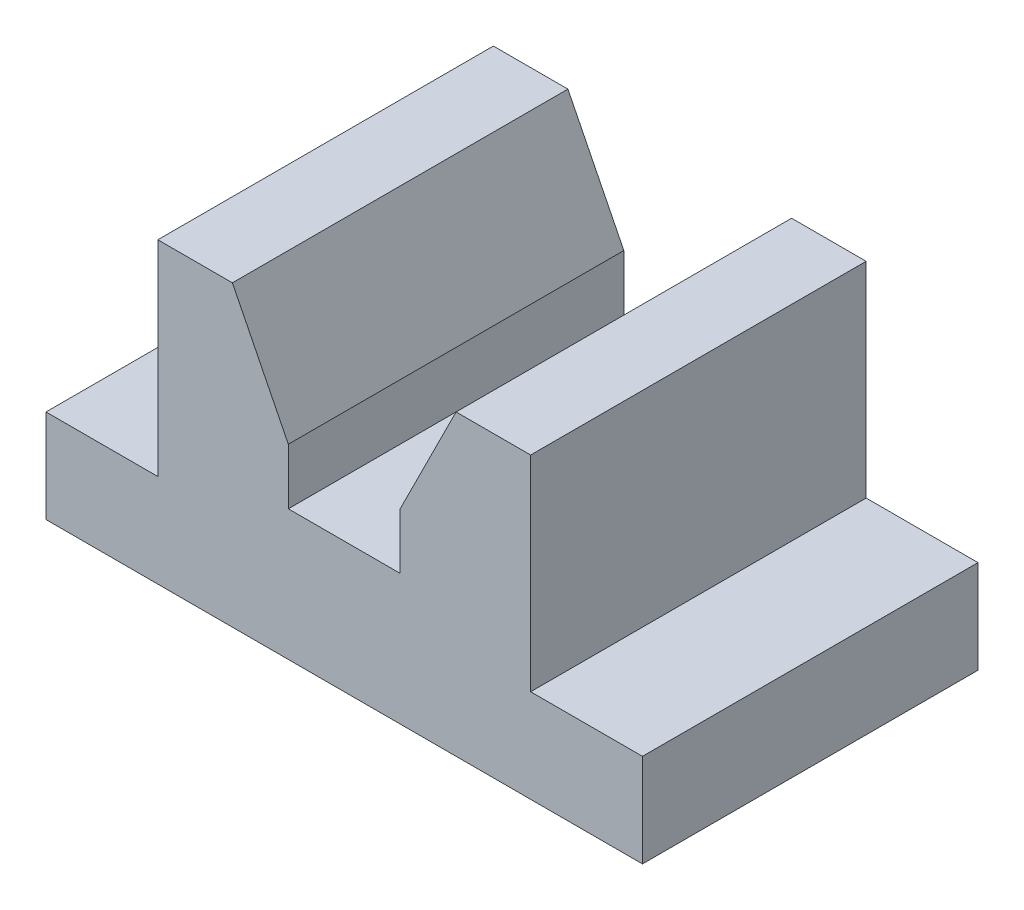
ISO-10303-21;
HEADER;
FILE_DESCRIPTION(('STEP AP214'),'2;1');
FILE_NAME('part.step','',(''),(''),'','','');
FILE_SCHEMA(('AUTOMOTIVE_DESIGN { 1 0 10303 214 1 1 1 1 }'));
ENDSEC;
DATA;
#1=APPLICATION_CONTEXT('core data for automotive mechanical design processes');
#2=APPLICATION_PROTOCOL_DEFINITION('international standard','automotive_design',2000,#1);
#3=PRODUCT_CONTEXT('',#1,'mechanical');
#4=PRODUCT('Part','Part','',(#3));
#5=PRODUCT_RELATED_PRODUCT_CATEGORY('part','',(#4));
#6=PRODUCT_DEFINITION_FORMATION('','',#4);
#7=PRODUCT_DEFINITION_CONTEXT('part definition',#1,'design');
#8=PRODUCT_DEFINITION('design','',#6,#7);
#9=PRODUCT_DEFINITION_SHAPE('','',#8);
#10=(LENGTH_UNIT() NAMED_UNIT(*) SI_UNIT(.MILLI.,.METRE.));
#11=(NAMED_UNIT(*) PLANE_ANGLE_UNIT() SI_UNIT($,.RADIAN.));
#12=(NAMED_UNIT(*) SI_UNIT($,.STERADIAN.) SOLID_ANGLE_UNIT());
#13=UNCERTAINTY_MEASURE_WITH_UNIT(LENGTH_MEASURE(1.E-05),#10,'distance_accuracy_value','');
#14=(GEOMETRIC_REPRESENTATION_CONTEXT(3) GLOBAL_UNCERTAINTY_ASSIGNED_CONTEXT((#13)) GLOBAL_UNIT_ASSIGNED_CONTEXT((#10,
#11,#12)) REPRESENTATION_CONTEXT('',''));
#15=CARTESIAN_POINT('',(0.,0.,0.));
#16=DIRECTION('',(0.,0.,1.));
#17=DIRECTION('',(1.,0.,0.));
#18=AXIS2_PLACEMENT_3D('',#15,#16,#17);
#19=CARTESIAN_POINT('',(-16.,0.,18.));
#20=DIRECTION('',(1.,0.,0.));
#21=DIRECTION('',(0.,0.,-1.));
#22=AXIS2_PLACEMENT_3D('',#19,#20,#21);
#23=PLANE('',#22);
#24=DIRECTION('',(0.,-1.,0.));
#25=VECTOR('',#24,1.);
#26=CARTESIAN_POINT('',(-16.,0.,0.));
#27=LINE('',#26,#25);
#28=CARTESIAN_POINT('',(-16.,5.,0.));
#29=VERTEX_POINT('',#28);
#30=CARTESIAN_POINT('',(-16.,0.,0.));
#31=VERTEX_POINT('',#30);
#32=EDGE_CURVE('E182',#29,#31,#27,.T.);
#33=ORIENTED_EDGE('',*,*,#32,.T.);
#34=DIRECTION('',(0.,0.,-1.));
#35=VECTOR('',#34,1.);
#36=CARTESIAN_POINT('',(-16.,0.,18.));
#37=LINE('',#36,#35);
#38=CARTESIAN_POINT('',(-16.,0.,18.));
#39=VERTEX_POINT('',#38);
#40=EDGE_CURVE('E11',#39,#31,#37,.T.);
#41=ORIENTED_EDGE('',*,*,#40,.F.);
#42=DIRECTION('',(0.,-1.,0.));
#43=VECTOR('',#42,1.);
#44=CARTESIAN_POINT('',(-16.,0.,18.));
#45=LINE('',#44,#43);
#46=CARTESIAN_POINT('',(-16.,5.,18.));
#47=VERTEX_POINT('',#46);
#48=EDGE_CURVE('E222',#47,#39,#45,.T.);
#49=ORIENTED_EDGE('',*,*,#48,.F.);
#50=DIRECTION('',(0.,0.,-1.));
#51=VECTOR('',#50,1.);
#52=CARTESIAN_POINT('',(-16.,5.,18.));
#53=LINE('',#52,#51);
#54=EDGE_CURVE('E178',#47,#29,#53,.T.);
#55=ORIENTED_EDGE('',*,*,#54,.T.);
#56=EDGE_LOOP('',(#33,#41,#49,#55));
#57=FACE_BOUND('',#56,.T.);
#58=ADVANCED_FACE('F45',(#57),#23,.F.);
#59=CARTESIAN_POINT('',(16.,0.,18.));
#60=DIRECTION('',(0.,1.,0.));
#61=DIRECTION('',(0.,0.,1.));
#62=AXIS2_PLACEMENT_3D('',#59,#60,#61);
#63=PLANE('',#62);
#64=DIRECTION('',(1.,0.,0.));
#65=VECTOR('',#64,1.);
#66=CARTESIAN_POINT('',(16.,0.,0.));
#67=LINE('',#66,#65);
#68=CARTESIAN_POINT('',(16.,0.,0.));
#69=VERTEX_POINT('',#68);
#70=EDGE_CURVE('E186',#31,#69,#67,.T.);
#71=ORIENTED_EDGE('',*,*,#70,.T.);
#72=DIRECTION('',(0.,0.,-1.));
#73=VECTOR('',#72,1.);
#74=CARTESIAN_POINT('',(16.,0.,18.));
#75=LINE('',#74,#73);
#76=CARTESIAN_POINT('',(16.,0.,18.));
#77=VERTEX_POINT('',#76);
#78=EDGE_CURVE('E54',#77,#69,#75,.T.);
#79=ORIENTED_EDGE('',*,*,#78,.F.);
#80=DIRECTION('',(1.,0.,0.));
#81=VECTOR('',#80,1.);
#82=CARTESIAN_POINT('',(16.,0.,18.));
#83=LINE('',#82,#81);
#84=EDGE_CURVE('E123',#39,#77,#83,.T.);
#85=ORIENTED_EDGE('',*,*,#84,.F.);
#86=ORIENTED_EDGE('',*,*,#40,.T.);
#87=EDGE_LOOP('',(#71,#79,#85,#86));
#88=FACE_BOUND('',#87,.T.);
#89=ADVANCED_FACE('F330',(#88),#63,.F.);
#90=CARTESIAN_POINT('',(16.,0.,18.));
#91=DIRECTION('',(-1.,0.,0.));
#92=DIRECTION('',(0.,0.,1.));
#93=AXIS2_PLACEMENT_3D('',#90,#91,#92);
#94=PLANE('',#93);
#95=DIRECTION('',(0.,1.,0.));
#96=VECTOR('',#95,1.);
#97=CARTESIAN_POINT('',(16.,0.,0.));
#98=LINE('',#97,#96);
#99=CARTESIAN_POINT('',(16.,5.,0.));
#100=VERTEX_POINT('',#99);
#101=EDGE_CURVE('E189',#69,#100,#98,.T.);
#102=ORIENTED_EDGE('',*,*,#101,.T.);
#103=DIRECTION('',(0.,0.,-1.));
#104=VECTOR('',#103,1.);
#105=CARTESIAN_POINT('',(16.,5.,18.));
#106=LINE('',#105,#104);
#107=CARTESIAN_POINT('',(16.,5.,18.));
#108=VERTEX_POINT('',#107);
#109=EDGE_CURVE('E257',#108,#100,#106,.T.);
#110=ORIENTED_EDGE('',*,*,#109,.F.);
#111=DIRECTION('',(0.,1.,0.));
#112=VECTOR('',#111,1.);
#113=CARTESIAN_POINT('',(16.,0.,18.));
#114=LINE('',#113,#112);
#115=EDGE_CURVE('E267',#77,#108,#114,.T.);
#116=ORIENTED_EDGE('',*,*,#115,.F.);
#117=ORIENTED_EDGE('',*,*,#78,.T.);
#118=EDGE_LOOP('',(#102,#110,#116,#117));
#119=FACE_BOUND('',#118,.T.);
#120=ADVANCED_FACE('F265',(#119),#94,.F.);
#121=CARTESIAN_POINT('',(16.,5.,18.));
#122=DIRECTION('',(0.,-1.,0.));
#123=DIRECTION('',(1.,0.,0.));
#124=AXIS2_PLACEMENT_3D('',#121,#122,#123);
#125=PLANE('',#124);
#126=DIRECTION('',(-1.,0.,0.));
#127=VECTOR('',#126,1.);
#128=CARTESIAN_POINT('',(16.,5.,0.));
#129=LINE('',#128,#127);
#130=CARTESIAN_POINT('',(10.,4.99999999999999,0.));
#131=VERTEX_POINT('',#130);
#132=EDGE_CURVE('E192',#100,#131,#129,.T.);
#133=ORIENTED_EDGE('',*,*,#132,.T.);
#134=DIRECTION('',(0.,0.,-1.));
#135=VECTOR('',#134,1.);
#136=CARTESIAN_POINT('',(10.,4.99999999999999,18.));
#137=LINE('',#136,#135);
#138=CARTESIAN_POINT('',(10.,4.99999999999999,18.));
#139=VERTEX_POINT('',#138);
#140=EDGE_CURVE('E253',#139,#131,#137,.T.);
#141=ORIENTED_EDGE('',*,*,#140,.F.);
#142=DIRECTION('',(-1.,0.,0.));
#143=VECTOR('',#142,1.);
#144=CARTESIAN_POINT('',(16.,5.,18.));
#145=LINE('',#144,#143);
#146=EDGE_CURVE('E286',#108,#139,#145,.T.);
#147=ORIENTED_EDGE('',*,*,#146,.F.);
#148=ORIENTED_EDGE('',*,*,#109,.T.);
#149=EDGE_LOOP('',(#133,#141,#147,#148));
#150=FACE_BOUND('',#149,.T.);
#151=ADVANCED_FACE('F276',(#150),#125,.F.);
#152=CARTESIAN_POINT('',(10.,4.99999999999999,18.));
#153=DIRECTION('',(-1.,0.,0.));
#154=DIRECTION('',(0.,-1.,0.));
#155=AXIS2_PLACEMENT_3D('',#152,#153,#154);
#156=PLANE('',#155);
#157=DIRECTION('',(0.,1.,0.));
#158=VECTOR('',#157,1.);
#159=CARTESIAN_POINT('',(10.,4.99999999999999,0.));
#160=LINE('',#159,#158);
#161=CARTESIAN_POINT('',(10.,16.,0.));
#162=VERTEX_POINT('',#161);
#163=EDGE_CURVE('E195',#131,#162,#160,.T.);
#164=ORIENTED_EDGE('',*,*,#163,.T.);
#165=DIRECTION('',(0.,0.,-1.));
#166=VECTOR('',#165,1.);
#167=CARTESIAN_POINT('',(10.,16.,18.));
#168=LINE('',#167,#166);
#169=CARTESIAN_POINT('',(10.,16.,18.));
#170=VERTEX_POINT('',#169);
#171=EDGE_CURVE('E249',#170,#162,#168,.T.);
#172=ORIENTED_EDGE('',*,*,#171,.F.);
#173=DIRECTION('',(0.,1.,0.));
#174=VECTOR('',#173,1.);
#175=CARTESIAN_POINT('',(10.,4.99999999999999,18.));
#176=LINE('',#175,#174);
#177=EDGE_CURVE('E282',#139,#170,#176,.T.);
#178=ORIENTED_EDGE('',*,*,#177,.F.);
#179=ORIENTED_EDGE('',*,*,#140,.T.);
#180=EDGE_LOOP('',(#164,#172,#178,#179));
#181=FACE_BOUND('',#180,.T.);
#182=ADVANCED_FACE('F280',(#181),#156,.F.);
#183=CARTESIAN_POINT('',(10.,16.,18.));
#184=DIRECTION('',(0.,-1.,0.));
#185=DIRECTION('',(1.,0.,0.));
#186=AXIS2_PLACEMENT_3D('',#183,#184,#185);
#187=PLANE('',#186);
#188=DIRECTION('',(-1.,0.,0.));
#189=VECTOR('',#188,1.);
#190=CARTESIAN_POINT('',(10.,16.,0.));
#191=LINE('',#190,#189);
#192=CARTESIAN_POINT('',(6.,16.,0.));
#193=VERTEX_POINT('',#192);
#194=EDGE_CURVE('E198',#162,#193,#191,.T.);
#195=ORIENTED_EDGE('',*,*,#194,.T.);
#196=DIRECTION('',(0.,0.,-1.));
#197=VECTOR('',#196,1.);
#198=CARTESIAN_POINT('',(6.,16.,18.));
#199=LINE('',#198,#197);
#200=CARTESIAN_POINT('',(6.,16.,18.));
#201=VERTEX_POINT('',#200);
#202=EDGE_CURVE('E245',#201,#193,#199,.T.);
#203=ORIENTED_EDGE('',*,*,#202,.F.);
#204=DIRECTION('',(-1.,0.,0.));
#205=VECTOR('',#204,1.);
#206=CARTESIAN_POINT('',(10.,16.,18.));
#207=LINE('',#206,#205);
#208=EDGE_CURVE('E285',#170,#201,#207,.T.);
#209=ORIENTED_EDGE('',*,*,#208,.F.);
#210=ORIENTED_EDGE('',*,*,#171,.T.);
#211=EDGE_LOOP('',(#195,#203,#209,#210));
#212=FACE_BOUND('',#211,.T.);
#213=ADVANCED_FACE('F343',(#212),#187,.F.);
#214=CARTESIAN_POINT('',(6.,16.,18.));
#215=DIRECTION('',(0.894427190999916,-0.447213595499957,0.));
#216=DIRECTION('',(0.447213595499957,0.894427190999916,0.));
#217=AXIS2_PLACEMENT_3D('',#214,#215,#216);
#218=PLANE('',#217);
#219=DIRECTION('',(-0.447213595499957,-0.894427190999916,0.));
#220=VECTOR('',#219,1.);
#221=CARTESIAN_POINT('',(6.,16.,0.));
#222=LINE('',#221,#220);
#223=CARTESIAN_POINT('',(3.,10.,0.));
#224=VERTEX_POINT('',#223);
#225=EDGE_CURVE('E201',#193,#224,#222,.T.);
#226=ORIENTED_EDGE('',*,*,#225,.T.);
#227=DIRECTION('',(0.,0.,-1.));
#228=VECTOR('',#227,1.);
#229=CARTESIAN_POINT('',(3.,10.,18.));
#230=LINE('',#229,#228);
#231=CARTESIAN_POINT('',(3.,10.,18.));
#232=VERTEX_POINT('',#231);
#233=EDGE_CURVE('E241',#232,#224,#230,.T.);
#234=ORIENTED_EDGE('',*,*,#233,.F.);
#235=DIRECTION('',(-0.447213595499957,-0.894427190999916,0.));
#236=VECTOR('',#235,1.);
#237=CARTESIAN_POINT('',(6.,16.,18.));
#238=LINE('',#237,#236);
#239=EDGE_CURVE('E290',#201,#232,#238,.T.);
#240=ORIENTED_EDGE('',*,*,#239,.F.);
#241=ORIENTED_EDGE('',*,*,#202,.T.);
#242=EDGE_LOOP('',(#226,#234,#240,#241));
#243=FACE_BOUND('',#242,.T.);
#244=ADVANCED_FACE('F346',(#243),#218,.F.);
#245=CARTESIAN_POINT('',(3.,10.,18.));
#246=DIRECTION('',(1.,0.,0.));
#247=DIRECTION('',(0.,1.,0.));
#248=AXIS2_PLACEMENT_3D('',#245,#246,#247);
#249=PLANE('',#248);
#250=DIRECTION('',(0.,-1.,0.));
#251=VECTOR('',#250,1.);
#252=CARTESIAN_POINT('',(3.,10.,0.));
#253=LINE('',#252,#251);
#254=CARTESIAN_POINT('',(3.,7.,0.));
#255=VERTEX_POINT('',#254);
#256=EDGE_CURVE('E204',#224,#255,#253,.T.);
#257=ORIENTED_EDGE('',*,*,#256,.T.);
#258=DIRECTION('',(0.,0.,-1.));
#259=VECTOR('',#258,1.);
#260=CARTESIAN_POINT('',(3.,7.,18.));
#261=LINE('',#260,#259);
#262=CARTESIAN_POINT('',(3.,7.,18.));
#263=VERTEX_POINT('',#262);
#264=EDGE_CURVE('E237',#263,#255,#261,.T.);
#265=ORIENTED_EDGE('',*,*,#264,.F.);
#266=DIRECTION('',(0.,-1.,0.));
#267=VECTOR('',#266,1.);
#268=CARTESIAN_POINT('',(3.,10.,18.));
#269=LINE('',#268,#267);
#270=EDGE_CURVE('E297',#232,#263,#269,.T.);
#271=ORIENTED_EDGE('',*,*,#270,.F.);
#272=ORIENTED_EDGE('',*,*,#233,.T.);
#273=EDGE_LOOP('',(#257,#265,#271,#272));
#274=FACE_BOUND('',#273,.T.);
#275=ADVANCED_FACE('F350',(#274),#249,.F.);
#276=CARTESIAN_POINT('',(-3.,7.,18.));
#277=DIRECTION('',(0.,-1.,0.));
#278=DIRECTION('',(0.,0.,-1.));
#279=AXIS2_PLACEMENT_3D('',#276,#277,#278);
#280=PLANE('',#279);
#281=DIRECTION('',(-1.,0.,0.));
#282=VECTOR('',#281,1.);
#283=CARTESIAN_POINT('',(-3.,7.,0.));
#284=LINE('',#283,#282);
#285=CARTESIAN_POINT('',(-3.,7.,0.));
#286=VERTEX_POINT('',#285);
#287=EDGE_CURVE('E207',#255,#286,#284,.T.);
#288=ORIENTED_EDGE('',*,*,#287,.T.);
#289=DIRECTION('',(0.,0.,-1.));
#290=VECTOR('',#289,1.);
#291=CARTESIAN_POINT('',(-3.,7.,18.));
#292=LINE('',#291,#290);
#293=CARTESIAN_POINT('',(-3.,7.,18.));
#294=VERTEX_POINT('',#293);
#295=EDGE_CURVE('E233',#294,#286,#292,.T.);
#296=ORIENTED_EDGE('',*,*,#295,.F.);
#297=DIRECTION('',(-1.,0.,0.));
#298=VECTOR('',#297,1.);
#299=CARTESIAN_POINT('',(-3.,7.,18.));
#300=LINE('',#299,#298);
#301=EDGE_CURVE('E300',#263,#294,#300,.T.);
#302=ORIENTED_EDGE('',*,*,#301,.F.);
#303=ORIENTED_EDGE('',*,*,#264,.T.);
#304=EDGE_LOOP('',(#288,#296,#302,#303));
#305=FACE_BOUND('',#304,.T.);
#306=ADVANCED_FACE('F354',(#305),#280,.F.);
#307=CARTESIAN_POINT('',(-3.,10.,18.));
#308=DIRECTION('',(-1.,0.,0.));
#309=DIRECTION('',(0.,-1.,0.));
#310=AXIS2_PLACEMENT_3D('',#307,#308,#309);
#311=PLANE('',#310);
#312=DIRECTION('',(0.,1.,0.));
#313=VECTOR('',#312,1.);
#314=CARTESIAN_POINT('',(-3.,10.,0.));
#315=LINE('',#314,#313);
#316=CARTESIAN_POINT('',(-3.,10.,0.));
#317=VERTEX_POINT('',#316);
#318=EDGE_CURVE('E210',#286,#317,#315,.T.);
#319=ORIENTED_EDGE('',*,*,#318,.T.);
#320=DIRECTION('',(0.,0.,-1.));
#321=VECTOR('',#320,1.);
#322=CARTESIAN_POINT('',(-3.,10.,18.));
#323=LINE('',#322,#321);
#324=CARTESIAN_POINT('',(-3.,10.,18.));
#325=VERTEX_POINT('',#324);
#326=EDGE_CURVE('E229',#325,#317,#323,.T.);
#327=ORIENTED_EDGE('',*,*,#326,.F.);
#328=DIRECTION('',(0.,1.,0.));
#329=VECTOR('',#328,1.);
#330=CARTESIAN_POINT('',(-3.,10.,18.));
#331=LINE('',#330,#329);
#332=EDGE_CURVE('E303',#294,#325,#331,.T.);
#333=ORIENTED_EDGE('',*,*,#332,.F.);
#334=ORIENTED_EDGE('',*,*,#295,.T.);
#335=EDGE_LOOP('',(#319,#327,#333,#334));
#336=FACE_BOUND('',#335,.T.);
#337=ADVANCED_FACE('F311',(#336),#311,.F.);
#338=CARTESIAN_POINT('',(-6.,16.,18.));
#339=DIRECTION('',(-0.894427190999916,-0.447213595499957,0.));
#340=DIRECTION('',(0.447213595499957,-0.894427190999916,0.));
#341=AXIS2_PLACEMENT_3D('',#338,#339,#340);
#342=PLANE('',#341);
#343=DIRECTION('',(-0.447213595499957,0.894427190999916,0.));
#344=VECTOR('',#343,1.);
#345=CARTESIAN_POINT('',(-6.,16.,0.));
#346=LINE('',#345,#344);
#347=CARTESIAN_POINT('',(-6.,16.,0.));
#348=VERTEX_POINT('',#347);
#349=EDGE_CURVE('E213',#317,#348,#346,.T.);
#350=ORIENTED_EDGE('',*,*,#349,.T.);
#351=DIRECTION('',(0.,0.,-1.));
#352=VECTOR('',#351,1.);
#353=CARTESIAN_POINT('',(-6.,16.,18.));
#354=LINE('',#353,#352);
#355=CARTESIAN_POINT('',(-6.,16.,18.));
#356=VERTEX_POINT('',#355);
#357=EDGE_CURVE('E171',#356,#348,#354,.T.);
#358=ORIENTED_EDGE('',*,*,#357,.F.);
#359=DIRECTION('',(-0.447213595499957,0.894427190999916,0.));
#360=VECTOR('',#359,1.);
#361=CARTESIAN_POINT('',(-6.,16.,18.));
#362=LINE('',#361,#360);
#363=EDGE_CURVE('E160',#325,#356,#362,.T.);
#364=ORIENTED_EDGE('',*,*,#363,.F.);
#365=ORIENTED_EDGE('',*,*,#326,.T.);
#366=EDGE_LOOP('',(#350,#358,#364,#365));
#367=FACE_BOUND('',#366,.T.);
#368=ADVANCED_FACE('F315',(#367),#342,.F.);
#369=CARTESIAN_POINT('',(-10.,16.,18.));
#370=DIRECTION('',(0.,-1.,0.));
#371=DIRECTION('',(1.,0.,0.));
#372=AXIS2_PLACEMENT_3D('',#369,#370,#371);
#373=PLANE('',#372);
#374=DIRECTION('',(-1.,0.,0.));
#375=VECTOR('',#374,1.);
#376=CARTESIAN_POINT('',(-10.,16.,0.));
#377=LINE('',#376,#375);
#378=CARTESIAN_POINT('',(-10.,16.,0.));
#379=VERTEX_POINT('',#378);
#380=EDGE_CURVE('E169',#348,#379,#377,.T.);
#381=ORIENTED_EDGE('',*,*,#380,.T.);
#382=DIRECTION('',(0.,0.,-1.));
#383=VECTOR('',#382,1.);
#384=CARTESIAN_POINT('',(-10.,16.,18.));
#385=LINE('',#384,#383);
#386=CARTESIAN_POINT('',(-10.,16.,18.));
#387=VERTEX_POINT('',#386);
#388=EDGE_CURVE('E166',#387,#379,#385,.T.);
#389=ORIENTED_EDGE('',*,*,#388,.F.);
#390=DIRECTION('',(-1.,0.,0.));
#391=VECTOR('',#390,1.);
#392=CARTESIAN_POINT('',(-10.,16.,18.));
#393=LINE('',#392,#391);
#394=EDGE_CURVE('E154',#356,#387,#393,.T.);
#395=ORIENTED_EDGE('',*,*,#394,.F.);
#396=ORIENTED_EDGE('',*,*,#357,.T.);
#397=EDGE_LOOP('',(#381,#389,#395,#396));
#398=FACE_BOUND('',#397,.T.);
#399=ADVANCED_FACE('F167',(#398),#373,.F.);
#400=CARTESIAN_POINT('',(-10.,4.99999999999999,18.));
#401=DIRECTION('',(1.,0.,0.));
#402=DIRECTION('',(0.,1.,0.));
#403=AXIS2_PLACEMENT_3D('',#400,#401,#402);
#404=PLANE('',#403);
#405=DIRECTION('',(0.,-1.,0.));
#406=VECTOR('',#405,1.);
#407=CARTESIAN_POINT('',(-10.,4.99999999999999,0.));
#408=LINE('',#407,#406);
#409=CARTESIAN_POINT('',(-10.,4.99999999999999,0.));
#410=VERTEX_POINT('',#409);
#411=EDGE_CURVE('E109',#379,#410,#408,.T.);
#412=ORIENTED_EDGE('',*,*,#411,.T.);
#413=DIRECTION('',(0.,0.,-1.));
#414=VECTOR('',#413,1.);
#415=CARTESIAN_POINT('',(-10.,4.99999999999999,18.));
#416=LINE('',#415,#414);
#417=CARTESIAN_POINT('',(-10.,4.99999999999999,18.));
#418=VERTEX_POINT('',#417);
#419=EDGE_CURVE('E172',#418,#410,#416,.T.);
#420=ORIENTED_EDGE('',*,*,#419,.F.);
#421=DIRECTION('',(0.,-1.,0.));
#422=VECTOR('',#421,1.);
#423=CARTESIAN_POINT('',(-10.,4.99999999999999,18.));
#424=LINE('',#423,#422);
#425=EDGE_CURVE('E158',#387,#418,#424,.T.);
#426=ORIENTED_EDGE('',*,*,#425,.F.);
#427=ORIENTED_EDGE('',*,*,#388,.T.);
#428=EDGE_LOOP('',(#412,#420,#426,#427));
#429=FACE_BOUND('',#428,.T.);
#430=ADVANCED_FACE('F174',(#429),#404,.F.);
#431=CARTESIAN_POINT('',(-16.,5.,18.));
#432=DIRECTION('',(0.,-1.,0.));
#433=DIRECTION('',(1.,0.,0.));
#434=AXIS2_PLACEMENT_3D('',#431,#432,#433);
#435=PLANE('',#434);
#436=DIRECTION('',(-1.,0.,0.));
#437=VECTOR('',#436,1.);
#438=CARTESIAN_POINT('',(-16.,5.,0.));
#439=LINE('',#438,#437);
#440=EDGE_CURVE('E115',#410,#29,#439,.T.);
#441=ORIENTED_EDGE('',*,*,#440,.T.);
#442=ORIENTED_EDGE('',*,*,#54,.F.);
#443=DIRECTION('',(-1.,0.,0.));
#444=VECTOR('',#443,1.);
#445=CARTESIAN_POINT('',(-16.,5.,18.));
#446=LINE('',#445,#444);
#447=EDGE_CURVE('E62',#418,#47,#446,.T.);
#448=ORIENTED_EDGE('',*,*,#447,.F.);
#449=ORIENTED_EDGE('',*,*,#419,.T.);
#450=EDGE_LOOP('',(#441,#442,#448,#449));
#451=FACE_BOUND('',#450,.T.);
#452=ADVANCED_FACE('F319',(#451),#435,.F.);
#453=CARTESIAN_POINT('',(0.,0.,18.));
#454=DIRECTION('',(0.,0.,-1.));
#455=DIRECTION('',(-1.,0.,0.));
#456=AXIS2_PLACEMENT_3D('',#453,#454,#455);
#457=PLANE('',#456);
#458=ORIENTED_EDGE('',*,*,#48,.T.);
#459=ORIENTED_EDGE('',*,*,#84,.T.);
#460=ORIENTED_EDGE('',*,*,#115,.T.);
#461=ORIENTED_EDGE('',*,*,#146,.T.);
#462=ORIENTED_EDGE('',*,*,#177,.T.);
#463=ORIENTED_EDGE('',*,*,#208,.T.);
#464=ORIENTED_EDGE('',*,*,#239,.T.);
#465=ORIENTED_EDGE('',*,*,#270,.T.);
#466=ORIENTED_EDGE('',*,*,#301,.T.);
#467=ORIENTED_EDGE('',*,*,#332,.T.);
#468=ORIENTED_EDGE('',*,*,#363,.T.);
#469=ORIENTED_EDGE('',*,*,#394,.T.);
#470=ORIENTED_EDGE('',*,*,#425,.T.);
#471=ORIENTED_EDGE('',*,*,#447,.T.);
#472=EDGE_LOOP('',(#458,#459,#460,#461,#462,#463,#464,#465,#466,#467,#468,#469,#470,#471));
#473=FACE_BOUND('',#472,.T.);
#474=ADVANCED_FACE('F156',(#473),#457,.F.);
#475=CARTESIAN_POINT('',(0.,0.,0.));
#476=DIRECTION('',(0.,0.,-1.));
#477=DIRECTION('',(-1.,0.,0.));
#478=AXIS2_PLACEMENT_3D('',#475,#476,#477);
#479=PLANE('',#478);
#480=ORIENTED_EDGE('',*,*,#32,.F.);
#481=ORIENTED_EDGE('',*,*,#440,.F.);
#482=ORIENTED_EDGE('',*,*,#411,.F.);
#483=ORIENTED_EDGE('',*,*,#380,.F.);
#484=ORIENTED_EDGE('',*,*,#349,.F.);
#485=ORIENTED_EDGE('',*,*,#318,.F.);
#486=ORIENTED_EDGE('',*,*,#287,.F.);
#487=ORIENTED_EDGE('',*,*,#256,.F.);
#488=ORIENTED_EDGE('',*,*,#225,.F.);
#489=ORIENTED_EDGE('',*,*,#194,.F.);
#490=ORIENTED_EDGE('',*,*,#163,.F.);
#491=ORIENTED_EDGE('',*,*,#132,.F.);
#492=ORIENTED_EDGE('',*,*,#101,.F.);
#493=ORIENTED_EDGE('',*,*,#70,.F.);
#494=EDGE_LOOP('',(#480,#481,#482,#483,#484,#485,#486,#487,#488,#489,#490,#491,#492,#493));
#495=FACE_BOUND('',#494,.T.);
#496=ADVANCED_FACE('F271',(#495),#479,.T.);
#497=CLOSED_SHELL('',(#58,#89,#120,#151,#182,#213,#244,#275,#306,#337,#368,#399,#430,#452,#474,#496));
#498=MANIFOLD_SOLID_BREP('B2',#497);
#499=ADVANCED_BREP_SHAPE_REPRESENTATION('',(#18,#498),#14);
#500=SHAPE_DEFINITION_REPRESENTATION(#9,#499);
ENDSEC;
END-ISO-10303-21;
